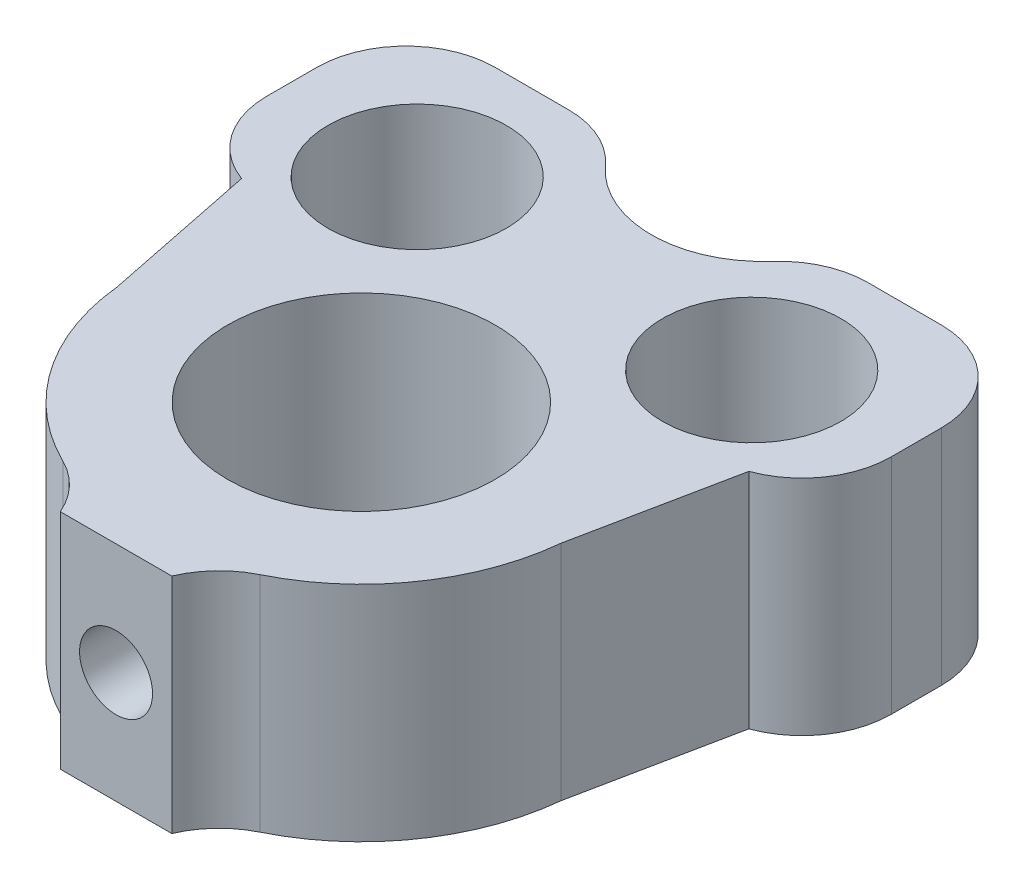
ISO-10303-21;
HEADER;
FILE_DESCRIPTION(('STEP AP214'),'2;1');
FILE_NAME('part.step','',(''),(''),'','','');
FILE_SCHEMA(('AUTOMOTIVE_DESIGN { 1 0 10303 214 1 1 1 1 }'));
ENDSEC;
DATA;
#1=APPLICATION_CONTEXT('core data for automotive mechanical design processes');
#2=APPLICATION_PROTOCOL_DEFINITION('international standard','automotive_design',2000,#1);
#3=PRODUCT_CONTEXT('',#1,'mechanical');
#4=PRODUCT('Part','Part','',(#3));
#5=PRODUCT_RELATED_PRODUCT_CATEGORY('part','',(#4));
#6=PRODUCT_DEFINITION_FORMATION('','',#4);
#7=PRODUCT_DEFINITION_CONTEXT('part definition',#1,'design');
#8=PRODUCT_DEFINITION('design','',#6,#7);
#9=PRODUCT_DEFINITION_SHAPE('','',#8);
#10=(LENGTH_UNIT() NAMED_UNIT(*) SI_UNIT(.MILLI.,.METRE.));
#11=(NAMED_UNIT(*) PLANE_ANGLE_UNIT() SI_UNIT($,.RADIAN.));
#12=(NAMED_UNIT(*) SI_UNIT($,.STERADIAN.) SOLID_ANGLE_UNIT());
#13=UNCERTAINTY_MEASURE_WITH_UNIT(LENGTH_MEASURE(1.E-05),#10,'distance_accuracy_value','');
#14=(GEOMETRIC_REPRESENTATION_CONTEXT(3) GLOBAL_UNCERTAINTY_ASSIGNED_CONTEXT((#13)) GLOBAL_UNIT_ASSIGNED_CONTEXT((#10,
#11,#12)) REPRESENTATION_CONTEXT('',''));
#15=CARTESIAN_POINT('',(0.,0.,0.));
#16=DIRECTION('',(0.,0.,1.));
#17=DIRECTION('',(1.,0.,0.));
#18=AXIS2_PLACEMENT_3D('',#15,#16,#17);
#19=CARTESIAN_POINT('',(0.,10.,0.));
#20=DIRECTION('',(0.,-1.,0.));
#21=DIRECTION('',(0.,0.,-1.));
#22=AXIS2_PLACEMENT_3D('',#19,#20,#21);
#23=CYLINDRICAL_SURFACE('',#22,10.);
#24=CARTESIAN_POINT('',(0.,10.,0.));
#25=DIRECTION('',(0.,1.,0.));
#26=DIRECTION('',(0.,0.,1.));
#27=AXIS2_PLACEMENT_3D('',#24,#25,#26);
#28=CIRCLE('',#27,10.);
#29=CARTESIAN_POINT('',(4.4164053143019,10.,8.97192087012619));
#30=VERTEX_POINT('',#29);
#31=CARTESIAN_POINT('',(9.9498743710662,10.,0.999999999999996));
#32=VERTEX_POINT('',#31);
#33=EDGE_CURVE('E218',#30,#32,#28,.T.);
#34=ORIENTED_EDGE('',*,*,#33,.F.);
#35=DIRECTION('',(0.,-1.,0.));
#36=VECTOR('',#35,1.);
#37=CARTESIAN_POINT('',(4.4164053143019,10.,8.97192087012619));
#38=LINE('',#37,#36);
#39=CARTESIAN_POINT('',(4.4164053143019,0.,8.97192087012619));
#40=VERTEX_POINT('',#39);
#41=EDGE_CURVE('E307',#30,#40,#38,.T.);
#42=ORIENTED_EDGE('',*,*,#41,.T.);
#43=CARTESIAN_POINT('',(0.,0.,0.));
#44=DIRECTION('',(0.,1.,0.));
#45=DIRECTION('',(0.,0.,1.));
#46=AXIS2_PLACEMENT_3D('',#43,#44,#45);
#47=CIRCLE('',#46,10.);
#48=CARTESIAN_POINT('',(9.9498743710662,0.,0.999999999999996));
#49=VERTEX_POINT('',#48);
#50=EDGE_CURVE('E237',#40,#49,#47,.T.);
#51=ORIENTED_EDGE('',*,*,#50,.T.);
#52=DIRECTION('',(0.,-1.,0.));
#53=VECTOR('',#52,1.);
#54=CARTESIAN_POINT('',(9.9498743710662,10.,0.999999999999996));
#55=LINE('',#54,#53);
#56=EDGE_CURVE('E226',#49,#32,#55,.F.);
#57=ORIENTED_EDGE('',*,*,#56,.T.);
#58=EDGE_LOOP('',(#34,#42,#51,#57));
#59=FACE_BOUND('',#58,.T.);
#60=ADVANCED_FACE('F37',(#59),#23,.T.);
#61=CARTESIAN_POINT('',(-9.9498743710662,0.,0.999999999999996));
#62=VERTEX_POINT('',#61);
#63=CARTESIAN_POINT('',(-4.4164053143019,0.,8.97192087012619));
#64=VERTEX_POINT('',#63);
#65=EDGE_CURVE('E238',#62,#64,#47,.T.);
#66=ORIENTED_EDGE('',*,*,#65,.T.);
#67=DIRECTION('',(0.,-1.,0.));
#68=VECTOR('',#67,1.);
#69=CARTESIAN_POINT('',(-4.4164053143019,10.,8.97192087012619));
#70=LINE('',#69,#68);
#71=CARTESIAN_POINT('',(-4.4164053143019,10.,8.97192087012619));
#72=VERTEX_POINT('',#71);
#73=EDGE_CURVE('E305',#64,#72,#70,.F.);
#74=ORIENTED_EDGE('',*,*,#73,.T.);
#75=CARTESIAN_POINT('',(-9.9498743710662,10.,0.999999999999996));
#76=VERTEX_POINT('',#75);
#77=EDGE_CURVE('E170',#76,#72,#28,.T.);
#78=ORIENTED_EDGE('',*,*,#77,.F.);
#79=DIRECTION('',(0.,-1.,0.));
#80=VECTOR('',#79,1.);
#81=CARTESIAN_POINT('',(-9.9498743710662,10.,0.999999999999996));
#82=LINE('',#81,#80);
#83=EDGE_CURVE('E248',#76,#62,#82,.T.);
#84=ORIENTED_EDGE('',*,*,#83,.T.);
#85=EDGE_LOOP('',(#66,#74,#78,#84));
#86=FACE_BOUND('',#85,.T.);
#87=ADVANCED_FACE('F356',(#86),#23,.T.);
#88=CARTESIAN_POINT('',(0.,10.,-18.));
#89=DIRECTION('',(0.,-1.,0.));
#90=DIRECTION('',(0.,0.,-1.));
#91=AXIS2_PLACEMENT_3D('',#88,#89,#90);
#92=CYLINDRICAL_SURFACE('',#91,5.);
#93=CARTESIAN_POINT('',(0.,10.,-18.));
#94=DIRECTION('',(0.,1.,0.));
#95=DIRECTION('',(0.,0.,1.));
#96=AXIS2_PLACEMENT_3D('',#93,#94,#95);
#97=CIRCLE('',#96,5.);
#98=CARTESIAN_POINT('',(-3.72677996249965,10.,-14.6666666666667));
#99=VERTEX_POINT('',#98);
#100=CARTESIAN_POINT('',(3.72677996249965,10.,-14.6666666666667));
#101=VERTEX_POINT('',#100);
#102=EDGE_CURVE('E209',#99,#101,#97,.T.);
#103=ORIENTED_EDGE('',*,*,#102,.T.);
#104=DIRECTION('',(0.,-1.,0.));
#105=VECTOR('',#104,1.);
#106=CARTESIAN_POINT('',(3.72677996249965,10.,-14.6666666666667));
#107=LINE('',#106,#105);
#108=CARTESIAN_POINT('',(3.72677996249965,0.,-14.6666666666667));
#109=VERTEX_POINT('',#108);
#110=EDGE_CURVE('E269',#101,#109,#107,.T.);
#111=ORIENTED_EDGE('',*,*,#110,.T.);
#112=CARTESIAN_POINT('',(0.,0.,-18.));
#113=DIRECTION('',(0.,1.,0.));
#114=DIRECTION('',(0.,0.,1.));
#115=AXIS2_PLACEMENT_3D('',#112,#113,#114);
#116=CIRCLE('',#115,5.);
#117=CARTESIAN_POINT('',(-3.72677996249965,0.,-14.6666666666667));
#118=VERTEX_POINT('',#117);
#119=EDGE_CURVE('E229',#118,#109,#116,.T.);
#120=ORIENTED_EDGE('',*,*,#119,.F.);
#121=DIRECTION('',(0.,-1.,0.));
#122=VECTOR('',#121,1.);
#123=CARTESIAN_POINT('',(-3.72677996249965,10.,-14.6666666666667));
#124=LINE('',#123,#122);
#125=EDGE_CURVE('E267',#118,#99,#124,.F.);
#126=ORIENTED_EDGE('',*,*,#125,.T.);
#127=EDGE_LOOP('',(#103,#111,#120,#126));
#128=FACE_BOUND('',#127,.T.);
#129=ADVANCED_FACE('F361',(#128),#92,.F.);
#130=CARTESIAN_POINT('',(0.,10.,-16.));
#131=DIRECTION('',(0.,0.,-1.));
#132=DIRECTION('',(-1.,0.,0.));
#133=AXIS2_PLACEMENT_3D('',#130,#131,#132);
#134=PLANE('',#133);
#135=DIRECTION('',(1.,0.,0.));
#136=VECTOR('',#135,1.);
#137=CARTESIAN_POINT('',(0.,10.,-16.));
#138=LINE('',#137,#136);
#139=CARTESIAN_POINT('',(-10.,10.,-16.));
#140=VERTEX_POINT('',#139);
#141=CARTESIAN_POINT('',(-6.70820393249937,10.,-16.));
#142=VERTEX_POINT('',#141);
#143=EDGE_CURVE('E213',#140,#142,#138,.T.);
#144=ORIENTED_EDGE('',*,*,#143,.T.);
#145=DIRECTION('',(0.,-1.,0.));
#146=VECTOR('',#145,1.);
#147=CARTESIAN_POINT('',(-6.70820393249937,10.,-16.));
#148=LINE('',#147,#146);
#149=CARTESIAN_POINT('',(-6.70820393249937,0.,-16.));
#150=VERTEX_POINT('',#149);
#151=EDGE_CURVE('E302',#142,#150,#148,.T.);
#152=ORIENTED_EDGE('',*,*,#151,.T.);
#153=DIRECTION('',(1.,0.,0.));
#154=VECTOR('',#153,1.);
#155=CARTESIAN_POINT('',(0.,0.,-16.));
#156=LINE('',#155,#154);
#157=CARTESIAN_POINT('',(-10.,0.,-16.));
#158=VERTEX_POINT('',#157);
#159=EDGE_CURVE('E232',#158,#150,#156,.T.);
#160=ORIENTED_EDGE('',*,*,#159,.F.);
#161=DIRECTION('',(0.,-1.,0.));
#162=VECTOR('',#161,1.);
#163=CARTESIAN_POINT('',(-10.,10.,-16.));
#164=LINE('',#163,#162);
#165=EDGE_CURVE('E300',#158,#140,#164,.F.);
#166=ORIENTED_EDGE('',*,*,#165,.T.);
#167=EDGE_LOOP('',(#144,#152,#160,#166));
#168=FACE_BOUND('',#167,.T.);
#169=ADVANCED_FACE('F369',(#168),#134,.T.);
#170=CARTESIAN_POINT('',(-14.,10.,0.));
#171=DIRECTION('',(1.,0.,0.));
#172=DIRECTION('',(0.,0.,-1.));
#173=AXIS2_PLACEMENT_3D('',#170,#171,#172);
#174=PLANE('',#173);
#175=DIRECTION('',(0.,0.,1.));
#176=VECTOR('',#175,1.);
#177=CARTESIAN_POINT('',(-14.,0.,0.));
#178=LINE('',#177,#176);
#179=CARTESIAN_POINT('',(-14.,0.,-12.));
#180=VERTEX_POINT('',#179);
#181=CARTESIAN_POINT('',(-14.,0.,-9.75760262150014));
#182=VERTEX_POINT('',#181);
#183=EDGE_CURVE('E235',#180,#182,#178,.T.);
#184=ORIENTED_EDGE('',*,*,#183,.T.);
#185=DIRECTION('',(0.,-1.,0.));
#186=VECTOR('',#185,1.);
#187=CARTESIAN_POINT('',(-14.,10.,-9.75760262150014));
#188=LINE('',#187,#186);
#189=CARTESIAN_POINT('',(-14.,10.,-9.75760262150014));
#190=VERTEX_POINT('',#189);
#191=EDGE_CURVE('E52',#182,#190,#188,.F.);
#192=ORIENTED_EDGE('',*,*,#191,.T.);
#193=DIRECTION('',(0.,0.,1.));
#194=VECTOR('',#193,1.);
#195=CARTESIAN_POINT('',(-14.,10.,0.));
#196=LINE('',#195,#194);
#197=CARTESIAN_POINT('',(-14.,10.,-12.));
#198=VERTEX_POINT('',#197);
#199=EDGE_CURVE('E216',#198,#190,#196,.T.);
#200=ORIENTED_EDGE('',*,*,#199,.F.);
#201=DIRECTION('',(0.,-1.,0.));
#202=VECTOR('',#201,1.);
#203=CARTESIAN_POINT('',(-14.,0.,-12.));
#204=LINE('',#203,#202);
#205=EDGE_CURVE('E314',#198,#180,#204,.T.);
#206=ORIENTED_EDGE('',*,*,#205,.T.);
#207=EDGE_LOOP('',(#184,#192,#200,#206));
#208=FACE_BOUND('',#207,.T.);
#209=ADVANCED_FACE('F366',(#208),#174,.F.);
#210=CARTESIAN_POINT('',(14.,10.,0.));
#211=DIRECTION('',(1.,0.,0.));
#212=DIRECTION('',(0.,0.,-1.));
#213=AXIS2_PLACEMENT_3D('',#210,#211,#212);
#214=PLANE('',#213);
#215=DIRECTION('',(0.,0.,1.));
#216=VECTOR('',#215,1.);
#217=CARTESIAN_POINT('',(14.,0.,0.));
#218=LINE('',#217,#216);
#219=CARTESIAN_POINT('',(14.,0.,-12.));
#220=VERTEX_POINT('',#219);
#221=CARTESIAN_POINT('',(14.,0.,-9.75760262150014));
#222=VERTEX_POINT('',#221);
#223=EDGE_CURVE('E241',#220,#222,#218,.T.);
#224=ORIENTED_EDGE('',*,*,#223,.F.);
#225=DIRECTION('',(0.,-1.,0.));
#226=VECTOR('',#225,1.);
#227=CARTESIAN_POINT('',(14.,10.,-12.));
#228=LINE('',#227,#226);
#229=CARTESIAN_POINT('',(14.,10.,-12.));
#230=VERTEX_POINT('',#229);
#231=EDGE_CURVE('E312',#220,#230,#228,.F.);
#232=ORIENTED_EDGE('',*,*,#231,.T.);
#233=DIRECTION('',(0.,0.,1.));
#234=VECTOR('',#233,1.);
#235=CARTESIAN_POINT('',(14.,10.,0.));
#236=LINE('',#235,#234);
#237=CARTESIAN_POINT('',(14.,10.,-9.75760262150014));
#238=VERTEX_POINT('',#237);
#239=EDGE_CURVE('E220',#230,#238,#236,.T.);
#240=ORIENTED_EDGE('',*,*,#239,.T.);
#241=DIRECTION('',(0.,-1.,0.));
#242=VECTOR('',#241,1.);
#243=CARTESIAN_POINT('',(14.,0.,-9.75760262150014));
#244=LINE('',#243,#242);
#245=EDGE_CURVE('E309',#238,#222,#244,.T.);
#246=ORIENTED_EDGE('',*,*,#245,.T.);
#247=EDGE_LOOP('',(#224,#232,#240,#246));
#248=FACE_BOUND('',#247,.T.);
#249=ADVANCED_FACE('F341',(#248),#214,.T.);
#250=CARTESIAN_POINT('',(0.,10.,0.));
#251=DIRECTION('',(0.,-1.,0.));
#252=DIRECTION('',(0.,0.,-1.));
#253=AXIS2_PLACEMENT_3D('',#250,#251,#252);
#254=CYLINDRICAL_SURFACE('',#253,6.);
#255=CARTESIAN_POINT('',(1.635125,5.,5.77289929189615));
#256=CARTESIAN_POINT('',(1.63512298519692,4.91000375329795,5.77290077436245));
#257=CARTESIAN_POINT('',(1.62766968552191,4.81998649751158,5.77502679013465));
#258=CARTESIAN_POINT('',(1.59811326653668,4.6425570713168,5.78327431075979));
#259=CARTESIAN_POINT('',(1.57600322043377,4.55514615308706,5.78939770475672));
#260=CARTESIAN_POINT('',(1.5179184156342,4.38552198827226,5.80489610436897));
#261=CARTESIAN_POINT('',(1.48196374143222,4.30330141221212,5.81426639772338));
#262=CARTESIAN_POINT('',(1.39727379172247,4.1460450833563,5.83519673272147));
#263=CARTESIAN_POINT('',(1.34853736297535,4.07100997970734,5.84675697192782));
#264=CARTESIAN_POINT('',(1.23830585587462,3.92829473627442,5.87110305087299));
#265=CARTESIAN_POINT('',(1.17653672092494,3.86083006595965,5.88391138248032));
#266=CARTESIAN_POINT('',(1.04258226060557,3.73707792736079,5.90911668267034));
#267=CARTESIAN_POINT('',(0.970395815988017,3.68079166164353,5.92151360687469));
#268=CARTESIAN_POINT('',(0.816155249502934,3.58008939043623,5.94475103913129));
#269=CARTESIAN_POINT('',(0.733955818670263,3.53588851756313,5.95556192542825));
#270=CARTESIAN_POINT('',(0.562948059077927,3.46201631475344,5.97415057479511));
#271=CARTESIAN_POINT('',(0.474140899364251,3.4323424216971,5.98192887288122));
#272=CARTESIAN_POINT('',(0.294688572937397,3.38906649410258,5.99341688723204));
#273=CARTESIAN_POINT('',(0.204137887369938,3.37509771335294,5.9972192933042));
#274=CARTESIAN_POINT('',(0.0219037979959537,3.36247370964267,6.00065156608423));
#275=CARTESIAN_POINT('',(-0.0697794053470975,3.36381581427557,6.00028216095226));
#276=CARTESIAN_POINT('',(-0.249119916467367,3.38151924103723,5.9954799472914));
#277=CARTESIAN_POINT('',(-0.33681966513502,3.39748417999799,5.9911543833868));
#278=CARTESIAN_POINT('',(-0.508244771487161,3.44333852825979,5.97905305422252));
#279=CARTESIAN_POINT('',(-0.591969897324019,3.47322874875305,5.97127708796711));
#280=CARTESIAN_POINT('',(-0.754069236573398,3.54638292677178,5.95299142109105));
#281=CARTESIAN_POINT('',(-0.832379820650359,3.58978079968337,5.94245452171454));
#282=CARTESIAN_POINT('',(-0.980740756912661,3.68861510803554,5.91977940684104));
#283=CARTESIAN_POINT('',(-1.05078943324005,3.74405397943264,5.90764086751929));
#284=CARTESIAN_POINT('',(-1.18300438191738,3.86749290347586,5.88261655469344));
#285=CARTESIAN_POINT('',(-1.24484639029213,3.93583836108446,5.8697193002789));
#286=CARTESIAN_POINT('',(-1.35627231432687,4.08206261338278,5.84498007645499));
#287=CARTESIAN_POINT('',(-1.4058554123767,4.1599420434248,5.8331381774664));
#288=CARTESIAN_POINT('',(-1.49161767441891,4.32375155057829,5.81180278075948));
#289=CARTESIAN_POINT('',(-1.52770497781927,4.40973198555712,5.80232551834122));
#290=CARTESIAN_POINT('',(-1.58480422905498,4.58686306013233,5.78699225535697));
#291=CARTESIAN_POINT('',(-1.60582010732332,4.67801234506354,5.78113531071391));
#292=CARTESIAN_POINT('',(-1.63161314351331,4.85985198340415,5.77390800546146));
#293=CARTESIAN_POINT('',(-1.6368755629965,4.9504682520841,5.7724036212407));
#294=CARTESIAN_POINT('',(-1.6323523563076,5.13128671445977,5.77368441141354));
#295=CARTESIAN_POINT('',(-1.62256841291026,5.2214889533287,5.77646910611959));
#296=CARTESIAN_POINT('',(-1.58865879648034,5.39702385374651,5.78588447122487));
#297=CARTESIAN_POINT('',(-1.56482825141144,5.482418192914,5.79243593178924));
#298=CARTESIAN_POINT('',(-1.50383544526522,5.64799685472993,5.80856846976467));
#299=CARTESIAN_POINT('',(-1.46667138675299,5.72818047322089,5.81814995562005));
#300=CARTESIAN_POINT('',(-1.37909235464982,5.88308233796589,5.83953546713665));
#301=CARTESIAN_POINT('',(-1.32839431123591,5.95763407922453,5.85138522732406));
#302=CARTESIAN_POINT('',(-1.21553480445696,6.09735003701422,5.87586614087553));
#303=CARTESIAN_POINT('',(-1.15337108703171,6.1625124031743,5.88849744756038));
#304=CARTESIAN_POINT('',(-1.01709400433403,6.28363224317477,5.91358224256265));
#305=CARTESIAN_POINT('',(-0.942675240154341,6.33925034614051,5.9260187005565));
#306=CARTESIAN_POINT('',(-0.785277572379418,6.43720677407253,5.94892041845398));
#307=CARTESIAN_POINT('',(-0.702299124538363,6.47954580558889,5.95938578322328));
#308=CARTESIAN_POINT('',(-0.530721235451654,6.54934778696696,5.9770986802536));
#309=CARTESIAN_POINT('',(-0.442169930062462,6.57692263713407,5.98437034027059));
#310=CARTESIAN_POINT('',(-0.26146157468052,6.61673322568729,5.99498284391056));
#311=CARTESIAN_POINT('',(-0.16930536715142,6.62897252615799,5.99832460034588));
#312=CARTESIAN_POINT('',(0.012832373403676,6.63753323780737,6.00065555153018));
#313=CARTESIAN_POINT('',(0.102789141508624,6.63435143371752,5.99978059134118));
#314=CARTESIAN_POINT('',(0.280836768958848,6.61331945837892,5.99408580615749));
#315=CARTESIAN_POINT('',(0.368927703835399,6.59546988206865,5.98926614116371));
#316=CARTESIAN_POINT('',(0.540117446157044,6.54589485104388,5.97625253608875));
#317=CARTESIAN_POINT('',(0.6232486541451,6.51427414099283,5.96808409413599));
#318=CARTESIAN_POINT('',(0.783072859085873,6.43814772330786,5.94922515775362));
#319=CARTESIAN_POINT('',(0.859764920871636,6.39364014825617,5.93853429784551));
#320=CARTESIAN_POINT('',(1.00683047814897,6.29157169132042,5.91540285557668));
#321=CARTESIAN_POINT('',(1.07697103798677,6.2336843194795,5.90292211131068));
#322=CARTESIAN_POINT('',(1.20671046896053,6.10711337329775,5.87777391141744));
#323=CARTESIAN_POINT('',(1.26630652007961,6.03842692010505,5.86510640682146));
#324=CARTESIAN_POINT('',(1.37464089536775,5.89028669767163,5.84067843331906));
#325=CARTESIAN_POINT('',(1.42309452768733,5.81061969859013,5.82894590433642));
#326=CARTESIAN_POINT('',(1.50585283001303,5.64396012071414,5.80811847621204));
#327=CARTESIAN_POINT('',(1.54016636150481,5.55697217119226,5.79902192618808));
#328=CARTESIAN_POINT('',(1.58940810291038,5.39197668713228,5.78570004050569));
#329=CARTESIAN_POINT('',(1.60651058233499,5.31465466391657,5.78093963569049));
#330=CARTESIAN_POINT('',(1.62936920120309,5.15822702255488,5.77453880642296));
#331=CARTESIAN_POINT('',(1.63512677134615,5.07912163058123,5.77289798856234));
#332=CARTESIAN_POINT('',(1.635125,5.,5.77289929189615));
#333=B_SPLINE_CURVE_WITH_KNOTS('',3,(#255,#256,#257,#258,#259,#260,#261,#262,#263,#264,#265,
#266,#267,#268,#269,#270,#271,#272,#273,#274,#275,#276,#277,#278,#279,#280,#281,#282,#283,#284,
#285,#286,#287,#288,#289,#290,#291,#292,#293,#294,#295,#296,#297,#298,#299,#300,#301,#302,#303,
#304,#305,#306,#307,#308,#309,#310,#311,#312,#313,#314,#315,#316,#317,#318,#319,#320,#321,#322,
#323,#324,#325,#326,#327,#328,#329,#330,#331,#332),.UNSPECIFIED.,.T.,.F.,(4,2,2,2,2,2,2,2,2,2,2,
2,2,2,2,2,2,2,2,2,2,2,2,2,2,2,2,2,2,2,2,2,2,2,2,2,2,2,4),(0.,0.269697649839978,
0.539522850009145,0.808958078788854,1.0784176258473,1.35423890998767,1.63008985078103,
1.91057159953333,2.19100384263132,2.46474181508852,2.73843200925486,3.00491599988255,
3.27141551599707,3.54064612844453,3.80993125846018,4.08783998398227,4.36576723967804,
4.64555321875653,4.92526620670625,5.19626955236703,5.46724259140619,5.73271563177333,
5.99822447290018,6.26979308089527,6.54141513413172,6.82128050122903,7.10113097478082,
7.37882926042553,7.6564630313781,7.92521352476596,8.19395311792211,8.46068340536446,
8.72745236368441,9.0015872363846,9.27579531309157,9.55637941782573,9.83678741439464,
10.0739262968588,10.3110352719687),.UNSPECIFIED.);
#334=CARTESIAN_POINT('',(1.635125,5.,5.77289929189615));
#335=VERTEX_POINT('',#334);
#336=EDGE_CURVE('E191',#335,#335,#333,.T.);
#337=ORIENTED_EDGE('',*,*,#336,.F.);
#338=EDGE_LOOP('',(#337));
#339=FACE_BOUND('',#338,.T.);
#340=CARTESIAN_POINT('',(0.,10.,0.));
#341=DIRECTION('',(0.,1.,0.));
#342=DIRECTION('',(0.,0.,1.));
#343=AXIS2_PLACEMENT_3D('',#340,#341,#342);
#344=CIRCLE('',#343,6.);
#345=CARTESIAN_POINT('',(0.,10.,6.));
#346=VERTEX_POINT('',#345);
#347=EDGE_CURVE('E206',#346,#346,#344,.T.);
#348=ORIENTED_EDGE('',*,*,#347,.T.);
#349=EDGE_LOOP('',(#348));
#350=FACE_BOUND('',#349,.T.);
#351=CARTESIAN_POINT('',(0.,0.,0.));
#352=DIRECTION('',(0.,1.,0.));
#353=DIRECTION('',(0.,0.,1.));
#354=AXIS2_PLACEMENT_3D('',#351,#352,#353);
#355=CIRCLE('',#354,6.);
#356=CARTESIAN_POINT('',(0.,0.,6.));
#357=VERTEX_POINT('',#356);
#358=EDGE_CURVE('E203',#357,#357,#355,.T.);
#359=ORIENTED_EDGE('',*,*,#358,.F.);
#360=EDGE_LOOP('',(#359));
#361=FACE_BOUND('',#360,.T.);
#362=ADVANCED_FACE('F376',(#339,#350,#361),#254,.F.);
#363=CARTESIAN_POINT('',(0.,10.,-16.));
#364=DIRECTION('',(0.,0.,-1.));
#365=DIRECTION('',(-1.,0.,0.));
#366=AXIS2_PLACEMENT_3D('',#363,#364,#365);
#367=PLANE('',#366);
#368=DIRECTION('',(1.,0.,0.));
#369=VECTOR('',#368,1.);
#370=CARTESIAN_POINT('',(0.,0.,-16.));
#371=LINE('',#370,#369);
#372=CARTESIAN_POINT('',(6.70820393249938,0.,-16.));
#373=VERTEX_POINT('',#372);
#374=CARTESIAN_POINT('',(10.,0.,-16.));
#375=VERTEX_POINT('',#374);
#376=EDGE_CURVE('E210',#373,#375,#371,.T.);
#377=ORIENTED_EDGE('',*,*,#376,.F.);
#378=DIRECTION('',(0.,-1.,0.));
#379=VECTOR('',#378,1.);
#380=CARTESIAN_POINT('',(6.70820393249938,10.,-16.));
#381=LINE('',#380,#379);
#382=CARTESIAN_POINT('',(6.70820393249938,10.,-16.));
#383=VERTEX_POINT('',#382);
#384=EDGE_CURVE('E287',#373,#383,#381,.F.);
#385=ORIENTED_EDGE('',*,*,#384,.T.);
#386=DIRECTION('',(1.,0.,0.));
#387=VECTOR('',#386,1.);
#388=CARTESIAN_POINT('',(0.,10.,-16.));
#389=LINE('',#388,#387);
#390=CARTESIAN_POINT('',(10.,10.,-16.));
#391=VERTEX_POINT('',#390);
#392=EDGE_CURVE('E223',#383,#391,#389,.T.);
#393=ORIENTED_EDGE('',*,*,#392,.T.);
#394=DIRECTION('',(0.,-1.,0.));
#395=VECTOR('',#394,1.);
#396=CARTESIAN_POINT('',(10.,10.,-16.));
#397=LINE('',#396,#395);
#398=EDGE_CURVE('E284',#391,#375,#397,.T.);
#399=ORIENTED_EDGE('',*,*,#398,.T.);
#400=EDGE_LOOP('',(#377,#385,#393,#399));
#401=FACE_BOUND('',#400,.T.);
#402=ADVANCED_FACE('F380',(#401),#367,.T.);
#403=CARTESIAN_POINT('',(0.,10.,0.));
#404=DIRECTION('',(0.,1.,0.));
#405=DIRECTION('',(0.,0.,1.));
#406=AXIS2_PLACEMENT_3D('',#403,#404,#405);
#407=PLANE('',#406);
#408=ORIENTED_EDGE('',*,*,#392,.F.);
#409=CARTESIAN_POINT('',(6.70820393249937,10.,-12.));
#410=DIRECTION('',(0.,1.,0.));
#411=DIRECTION('',(0.,0.,1.));
#412=AXIS2_PLACEMENT_3D('',#409,#410,#411);
#413=CIRCLE('',#412,4.);
#414=EDGE_CURVE('E298',#383,#101,#413,.T.);
#415=ORIENTED_EDGE('',*,*,#414,.T.);
#416=ORIENTED_EDGE('',*,*,#102,.F.);
#417=CARTESIAN_POINT('',(-6.70820393249937,10.,-12.));
#418=DIRECTION('',(0.,1.,0.));
#419=DIRECTION('',(0.,0.,1.));
#420=AXIS2_PLACEMENT_3D('',#417,#418,#419);
#421=CIRCLE('',#420,4.);
#422=EDGE_CURVE('E296',#99,#142,#421,.T.);
#423=ORIENTED_EDGE('',*,*,#422,.T.);
#424=ORIENTED_EDGE('',*,*,#143,.F.);
#425=CARTESIAN_POINT('',(-10.,10.,-12.));
#426=DIRECTION('',(0.,1.,0.));
#427=DIRECTION('',(0.,0.,1.));
#428=AXIS2_PLACEMENT_3D('',#425,#426,#427);
#429=CIRCLE('',#428,4.);
#430=EDGE_CURVE('E59',#140,#198,#429,.T.);
#431=ORIENTED_EDGE('',*,*,#430,.T.);
#432=ORIENTED_EDGE('',*,*,#199,.T.);
#433=CARTESIAN_POINT('',(-10.,10.,-9.75760262150014));
#434=DIRECTION('',(0.,1.,0.));
#435=DIRECTION('',(0.,0.,1.));
#436=AXIS2_PLACEMENT_3D('',#433,#434,#435);
#437=CIRCLE('',#436,4.);
#438=CARTESIAN_POINT('',(-11.3712849955043,10.,-6.));
#439=VERTEX_POINT('',#438);
#440=EDGE_CURVE('E290',#190,#439,#437,.T.);
#441=ORIENTED_EDGE('',*,*,#440,.T.);
#442=DIRECTION('',(0.198997487421337,0.,0.979999999999997));
#443=VECTOR('',#442,1.);
#444=CARTESIAN_POINT('',(-9.9498743710662,10.,0.99999999999999));
#445=LINE('',#444,#443);
#446=EDGE_CURVE('E260',#439,#76,#445,.T.);
#447=ORIENTED_EDGE('',*,*,#446,.T.);
#448=ORIENTED_EDGE('',*,*,#77,.T.);
#449=CARTESIAN_POINT('',(-6.18296744002267,10.,12.5606892181767));
#450=DIRECTION('',(0.,1.,0.));
#451=DIRECTION('',(0.,0.,1.));
#452=AXIS2_PLACEMENT_3D('',#449,#450,#451);
#453=CIRCLE('',#452,4.);
#454=CARTESIAN_POINT('',(-2.5,10.,11.));
#455=VERTEX_POINT('',#454);
#456=EDGE_CURVE('E163',#72,#455,#453,.F.);
#457=ORIENTED_EDGE('',*,*,#456,.T.);
#458=DIRECTION('',(1.,0.,0.));
#459=VECTOR('',#458,1.);
#460=CARTESIAN_POINT('',(-2.5,10.,11.));
#461=LINE('',#460,#459);
#462=CARTESIAN_POINT('',(2.5,10.,11.));
#463=VERTEX_POINT('',#462);
#464=EDGE_CURVE('E168',#455,#463,#461,.T.);
#465=ORIENTED_EDGE('',*,*,#464,.T.);
#466=CARTESIAN_POINT('',(6.18296744002267,10.,12.5606892181767));
#467=DIRECTION('',(0.,1.,0.));
#468=DIRECTION('',(0.,0.,1.));
#469=AXIS2_PLACEMENT_3D('',#466,#467,#468);
#470=CIRCLE('',#469,4.);
#471=EDGE_CURVE('E45',#463,#30,#470,.F.);
#472=ORIENTED_EDGE('',*,*,#471,.T.);
#473=ORIENTED_EDGE('',*,*,#33,.T.);
#474=DIRECTION('',(0.198997487421337,0.,-0.979999999999997));
#475=VECTOR('',#474,1.);
#476=CARTESIAN_POINT('',(11.3712849955043,10.,-6.));
#477=LINE('',#476,#475);
#478=CARTESIAN_POINT('',(11.3712849955043,10.,-6.));
#479=VERTEX_POINT('',#478);
#480=EDGE_CURVE('E265',#32,#479,#477,.T.);
#481=ORIENTED_EDGE('',*,*,#480,.T.);
#482=CARTESIAN_POINT('',(10.,10.,-9.75760262150014));
#483=DIRECTION('',(0.,1.,0.));
#484=DIRECTION('',(0.,0.,1.));
#485=AXIS2_PLACEMENT_3D('',#482,#483,#484);
#486=CIRCLE('',#485,4.);
#487=EDGE_CURVE('E292',#479,#238,#486,.T.);
#488=ORIENTED_EDGE('',*,*,#487,.T.);
#489=ORIENTED_EDGE('',*,*,#239,.F.);
#490=CARTESIAN_POINT('',(10.,10.,-12.));
#491=DIRECTION('',(0.,1.,0.));
#492=DIRECTION('',(0.,0.,1.));
#493=AXIS2_PLACEMENT_3D('',#490,#491,#492);
#494=CIRCLE('',#493,4.);
#495=EDGE_CURVE('E294',#230,#391,#494,.T.);
#496=ORIENTED_EDGE('',*,*,#495,.T.);
#497=EDGE_LOOP('',(#408,#415,#416,#423,#424,#431,#432,#441,#447,#448,#457,#465,#472,#473,#481,
#488,#489,#496));
#498=FACE_BOUND('',#497,.T.);
#499=CARTESIAN_POINT('',(7.5,10.,-10.));
#500=DIRECTION('',(0.,1.,0.));
#501=DIRECTION('',(0.,0.,1.));
#502=AXIS2_PLACEMENT_3D('',#499,#500,#501);
#503=CIRCLE('',#502,4.);
#504=CARTESIAN_POINT('',(7.5,10.,-6.));
#505=VERTEX_POINT('',#504);
#506=EDGE_CURVE('E185',#505,#505,#503,.T.);
#507=ORIENTED_EDGE('',*,*,#506,.F.);
#508=EDGE_LOOP('',(#507));
#509=FACE_BOUND('',#508,.T.);
#510=CARTESIAN_POINT('',(-7.5,10.,-10.));
#511=DIRECTION('',(0.,1.,0.));
#512=DIRECTION('',(0.,0.,1.));
#513=AXIS2_PLACEMENT_3D('',#510,#511,#512);
#514=CIRCLE('',#513,4.);
#515=CARTESIAN_POINT('',(-7.5,10.,-6.));
#516=VERTEX_POINT('',#515);
#517=EDGE_CURVE('E197',#516,#516,#514,.T.);
#518=ORIENTED_EDGE('',*,*,#517,.F.);
#519=EDGE_LOOP('',(#518));
#520=FACE_BOUND('',#519,.T.);
#521=ORIENTED_EDGE('',*,*,#347,.F.);
#522=EDGE_LOOP('',(#521));
#523=FACE_BOUND('',#522,.T.);
#524=ADVANCED_FACE('F166',(#498,#509,#520,#523),#407,.T.);
#525=CARTESIAN_POINT('',(0.,0.,0.));
#526=DIRECTION('',(0.,1.,0.));
#527=DIRECTION('',(0.,0.,1.));
#528=AXIS2_PLACEMENT_3D('',#525,#526,#527);
#529=PLANE('',#528);
#530=ORIENTED_EDGE('',*,*,#119,.T.);
#531=CARTESIAN_POINT('',(6.70820393249937,0.,-12.));
#532=DIRECTION('',(0.,1.,0.));
#533=DIRECTION('',(0.,0.,1.));
#534=AXIS2_PLACEMENT_3D('',#531,#532,#533);
#535=CIRCLE('',#534,4.);
#536=EDGE_CURVE('E282',#109,#373,#535,.F.);
#537=ORIENTED_EDGE('',*,*,#536,.T.);
#538=ORIENTED_EDGE('',*,*,#376,.T.);
#539=CARTESIAN_POINT('',(10.,0.,-12.));
#540=DIRECTION('',(0.,1.,0.));
#541=DIRECTION('',(0.,0.,1.));
#542=AXIS2_PLACEMENT_3D('',#539,#540,#541);
#543=CIRCLE('',#542,4.);
#544=EDGE_CURVE('E278',#375,#220,#543,.F.);
#545=ORIENTED_EDGE('',*,*,#544,.T.);
#546=ORIENTED_EDGE('',*,*,#223,.T.);
#547=CARTESIAN_POINT('',(10.,0.,-9.75760262150014));
#548=DIRECTION('',(0.,1.,0.));
#549=DIRECTION('',(0.,0.,1.));
#550=AXIS2_PLACEMENT_3D('',#547,#548,#549);
#551=CIRCLE('',#550,4.);
#552=CARTESIAN_POINT('',(11.3712849955043,0.,-6.));
#553=VERTEX_POINT('',#552);
#554=EDGE_CURVE('E276',#222,#553,#551,.F.);
#555=ORIENTED_EDGE('',*,*,#554,.T.);
#556=DIRECTION('',(-0.198997487421337,0.,0.979999999999997));
#557=VECTOR('',#556,1.);
#558=CARTESIAN_POINT('',(9.75087688364484,0.,1.98000000000013));
#559=LINE('',#558,#557);
#560=EDGE_CURVE('E262',#553,#49,#559,.T.);
#561=ORIENTED_EDGE('',*,*,#560,.T.);
#562=ORIENTED_EDGE('',*,*,#50,.F.);
#563=CARTESIAN_POINT('',(6.18296744002267,0.,12.5606892181767));
#564=DIRECTION('',(0.,1.,0.));
#565=DIRECTION('',(0.,0.,1.));
#566=AXIS2_PLACEMENT_3D('',#563,#564,#565);
#567=CIRCLE('',#566,4.);
#568=CARTESIAN_POINT('',(2.5,0.,11.));
#569=VERTEX_POINT('',#568);
#570=EDGE_CURVE('E11',#40,#569,#567,.T.);
#571=ORIENTED_EDGE('',*,*,#570,.T.);
#572=DIRECTION('',(1.,0.,0.));
#573=VECTOR('',#572,1.);
#574=CARTESIAN_POINT('',(-2.5,0.,11.));
#575=LINE('',#574,#573);
#576=CARTESIAN_POINT('',(-2.5,0.,11.));
#577=VERTEX_POINT('',#576);
#578=EDGE_CURVE('E186',#577,#569,#575,.T.);
#579=ORIENTED_EDGE('',*,*,#578,.F.);
#580=CARTESIAN_POINT('',(-6.18296744002267,0.,12.5606892181767));
#581=DIRECTION('',(0.,1.,0.));
#582=DIRECTION('',(0.,0.,1.));
#583=AXIS2_PLACEMENT_3D('',#580,#581,#582);
#584=CIRCLE('',#583,4.);
#585=EDGE_CURVE('E174',#577,#64,#584,.T.);
#586=ORIENTED_EDGE('',*,*,#585,.T.);
#587=ORIENTED_EDGE('',*,*,#65,.F.);
#588=DIRECTION('',(-0.198997487421337,0.,-0.979999999999997));
#589=VECTOR('',#588,1.);
#590=CARTESIAN_POINT('',(-9.75087688364484,0.,1.98000000000013));
#591=LINE('',#590,#589);
#592=CARTESIAN_POINT('',(-11.3712849955043,0.,-6.));
#593=VERTEX_POINT('',#592);
#594=EDGE_CURVE('E257',#62,#593,#591,.T.);
#595=ORIENTED_EDGE('',*,*,#594,.T.);
#596=CARTESIAN_POINT('',(-10.,0.,-9.75760262150014));
#597=DIRECTION('',(0.,1.,0.));
#598=DIRECTION('',(0.,0.,1.));
#599=AXIS2_PLACEMENT_3D('',#596,#597,#598);
#600=CIRCLE('',#599,4.);
#601=EDGE_CURVE('E274',#593,#182,#600,.F.);
#602=ORIENTED_EDGE('',*,*,#601,.T.);
#603=ORIENTED_EDGE('',*,*,#183,.F.);
#604=CARTESIAN_POINT('',(-10.,0.,-12.));
#605=DIRECTION('',(0.,1.,0.));
#606=DIRECTION('',(0.,0.,1.));
#607=AXIS2_PLACEMENT_3D('',#604,#605,#606);
#608=CIRCLE('',#607,4.);
#609=EDGE_CURVE('E272',#180,#158,#608,.F.);
#610=ORIENTED_EDGE('',*,*,#609,.T.);
#611=ORIENTED_EDGE('',*,*,#159,.T.);
#612=CARTESIAN_POINT('',(-6.70820393249937,0.,-12.));
#613=DIRECTION('',(0.,1.,0.));
#614=DIRECTION('',(0.,0.,1.));
#615=AXIS2_PLACEMENT_3D('',#612,#613,#614);
#616=CIRCLE('',#615,4.);
#617=EDGE_CURVE('E280',#150,#118,#616,.F.);
#618=ORIENTED_EDGE('',*,*,#617,.T.);
#619=EDGE_LOOP('',(#530,#537,#538,#545,#546,#555,#561,#562,#571,#579,#586,#587,#595,#602,#603,
#610,#611,#618));
#620=FACE_BOUND('',#619,.T.);
#621=ORIENTED_EDGE('',*,*,#358,.T.);
#622=EDGE_LOOP('',(#621));
#623=FACE_BOUND('',#622,.T.);
#624=CARTESIAN_POINT('',(-7.5,0.,-10.));
#625=DIRECTION('',(0.,1.,0.));
#626=DIRECTION('',(0.,0.,1.));
#627=AXIS2_PLACEMENT_3D('',#624,#625,#626);
#628=CIRCLE('',#627,4.);
#629=CARTESIAN_POINT('',(-7.5,0.,-6.));
#630=VERTEX_POINT('',#629);
#631=EDGE_CURVE('E200',#630,#630,#628,.T.);
#632=ORIENTED_EDGE('',*,*,#631,.T.);
#633=EDGE_LOOP('',(#632));
#634=FACE_BOUND('',#633,.T.);
#635=CARTESIAN_POINT('',(7.5,0.,-10.));
#636=DIRECTION('',(0.,1.,0.));
#637=DIRECTION('',(0.,0.,1.));
#638=AXIS2_PLACEMENT_3D('',#635,#636,#637);
#639=CIRCLE('',#638,4.);
#640=CARTESIAN_POINT('',(7.5,0.,-6.));
#641=VERTEX_POINT('',#640);
#642=EDGE_CURVE('E194',#641,#641,#639,.T.);
#643=ORIENTED_EDGE('',*,*,#642,.T.);
#644=EDGE_LOOP('',(#643));
#645=FACE_BOUND('',#644,.T.);
#646=ADVANCED_FACE('F328',(#620,#623,#634,#645),#529,.F.);
#647=CARTESIAN_POINT('',(-7.5,0.,-10.));
#648=DIRECTION('',(0.,1.,0.));
#649=DIRECTION('',(0.,0.,1.));
#650=AXIS2_PLACEMENT_3D('',#647,#648,#649);
#651=CYLINDRICAL_SURFACE('',#650,4.);
#652=ORIENTED_EDGE('',*,*,#631,.F.);
#653=EDGE_LOOP('',(#652));
#654=FACE_BOUND('',#653,.T.);
#655=ORIENTED_EDGE('',*,*,#517,.T.);
#656=EDGE_LOOP('',(#655));
#657=FACE_BOUND('',#656,.T.);
#658=ADVANCED_FACE('F403',(#654,#657),#651,.F.);
#659=CARTESIAN_POINT('',(7.5,0.,-10.));
#660=DIRECTION('',(0.,1.,0.));
#661=DIRECTION('',(0.,0.,1.));
#662=AXIS2_PLACEMENT_3D('',#659,#660,#661);
#663=CYLINDRICAL_SURFACE('',#662,4.);
#664=ORIENTED_EDGE('',*,*,#642,.F.);
#665=EDGE_LOOP('',(#664));
#666=FACE_BOUND('',#665,.T.);
#667=ORIENTED_EDGE('',*,*,#506,.T.);
#668=EDGE_LOOP('',(#667));
#669=FACE_BOUND('',#668,.T.);
#670=ADVANCED_FACE('F400',(#666,#669),#663,.F.);
#671=CARTESIAN_POINT('',(-9.9498743710662,10.,0.99999999999999));
#672=DIRECTION('',(0.979999999999997,0.,-0.198997487421337));
#673=DIRECTION('',(0.,-1.,0.));
#674=AXIS2_PLACEMENT_3D('',#671,#672,#673);
#675=PLANE('',#674);
#676=ORIENTED_EDGE('',*,*,#446,.F.);
#677=DIRECTION('',(0.,1.,0.));
#678=VECTOR('',#677,1.);
#679=CARTESIAN_POINT('',(-11.3712849955043,10.,-6.));
#680=LINE('',#679,#678);
#681=EDGE_CURVE('E251',#593,#439,#680,.T.);
#682=ORIENTED_EDGE('',*,*,#681,.F.);
#683=ORIENTED_EDGE('',*,*,#594,.F.);
#684=ORIENTED_EDGE('',*,*,#83,.F.);
#685=EDGE_LOOP('',(#676,#682,#683,#684));
#686=FACE_BOUND('',#685,.T.);
#687=ADVANCED_FACE('F382',(#686),#675,.F.);
#688=CARTESIAN_POINT('',(11.3712849955043,10.,-6.));
#689=DIRECTION('',(-0.979999999999997,0.,-0.198997487421337));
#690=DIRECTION('',(0.,-1.,0.));
#691=AXIS2_PLACEMENT_3D('',#688,#689,#690);
#692=PLANE('',#691);
#693=ORIENTED_EDGE('',*,*,#480,.F.);
#694=ORIENTED_EDGE('',*,*,#56,.F.);
#695=ORIENTED_EDGE('',*,*,#560,.F.);
#696=DIRECTION('',(0.,-1.,0.));
#697=VECTOR('',#696,1.);
#698=CARTESIAN_POINT('',(11.3712849955043,0.,-6.));
#699=LINE('',#698,#697);
#700=EDGE_CURVE('E254',#479,#553,#699,.T.);
#701=ORIENTED_EDGE('',*,*,#700,.F.);
#702=EDGE_LOOP('',(#693,#694,#695,#701));
#703=FACE_BOUND('',#702,.T.);
#704=ADVANCED_FACE('F333',(#703),#692,.F.);
#705=CARTESIAN_POINT('',(-2.5,15.3851648071345,11.));
#706=DIRECTION('',(0.,0.,-1.));
#707=DIRECTION('',(-1.,0.,0.));
#708=AXIS2_PLACEMENT_3D('',#705,#706,#707);
#709=PLANE('',#708);
#710=CARTESIAN_POINT('',(0.,5.,11.));
#711=DIRECTION('',(0.,0.,1.));
#712=DIRECTION('',(1.,0.,0.));
#713=AXIS2_PLACEMENT_3D('',#710,#711,#712);
#714=CIRCLE('',#713,1.635125);
#715=CARTESIAN_POINT('',(1.635125,5.,11.));
#716=VERTEX_POINT('',#715);
#717=EDGE_CURVE('E390',#716,#716,#714,.T.);
#718=ORIENTED_EDGE('',*,*,#717,.F.);
#719=EDGE_LOOP('',(#718));
#720=FACE_BOUND('',#719,.T.);
#721=ORIENTED_EDGE('',*,*,#464,.F.);
#722=DIRECTION('',(0.,-1.,0.));
#723=VECTOR('',#722,1.);
#724=CARTESIAN_POINT('',(-2.5,15.3851648071345,11.));
#725=LINE('',#724,#723);
#726=EDGE_CURVE('E181',#455,#577,#725,.T.);
#727=ORIENTED_EDGE('',*,*,#726,.T.);
#728=ORIENTED_EDGE('',*,*,#578,.T.);
#729=DIRECTION('',(0.,-1.,0.));
#730=VECTOR('',#729,1.);
#731=CARTESIAN_POINT('',(2.5,15.3851648071345,11.));
#732=LINE('',#731,#730);
#733=EDGE_CURVE('E184',#463,#569,#732,.T.);
#734=ORIENTED_EDGE('',*,*,#733,.F.);
#735=EDGE_LOOP('',(#721,#727,#728,#734));
#736=FACE_BOUND('',#735,.T.);
#737=ADVANCED_FACE('F179',(#720,#736),#709,.F.);
#738=CARTESIAN_POINT('',(0.,5.,0.999999999999999));
#739=DIRECTION('',(0.,0.,1.));
#740=DIRECTION('',(1.,0.,0.));
#741=AXIS2_PLACEMENT_3D('',#738,#739,#740);
#742=CYLINDRICAL_SURFACE('',#741,1.635125);
#743=ORIENTED_EDGE('',*,*,#336,.T.);
#744=EDGE_LOOP('',(#743));
#745=FACE_BOUND('',#744,.T.);
#746=ORIENTED_EDGE('',*,*,#717,.T.);
#747=EDGE_LOOP('',(#746));
#748=FACE_BOUND('',#747,.T.);
#749=ADVANCED_FACE('F391',(#745,#748),#742,.F.);
#750=CARTESIAN_POINT('',(6.70820393249937,10.,-12.));
#751=DIRECTION('',(0.,-1.,0.));
#752=DIRECTION('',(0.,0.,-1.));
#753=AXIS2_PLACEMENT_3D('',#750,#751,#752);
#754=CYLINDRICAL_SURFACE('',#753,4.);
#755=ORIENTED_EDGE('',*,*,#414,.F.);
#756=ORIENTED_EDGE('',*,*,#384,.F.);
#757=ORIENTED_EDGE('',*,*,#536,.F.);
#758=ORIENTED_EDGE('',*,*,#110,.F.);
#759=EDGE_LOOP('',(#755,#756,#757,#758));
#760=FACE_BOUND('',#759,.T.);
#761=ADVANCED_FACE('F395',(#760),#754,.T.);
#762=CARTESIAN_POINT('',(-6.70820393249937,10.,-12.));
#763=DIRECTION('',(0.,-1.,0.));
#764=DIRECTION('',(0.,0.,-1.));
#765=AXIS2_PLACEMENT_3D('',#762,#763,#764);
#766=CYLINDRICAL_SURFACE('',#765,4.);
#767=ORIENTED_EDGE('',*,*,#422,.F.);
#768=ORIENTED_EDGE('',*,*,#125,.F.);
#769=ORIENTED_EDGE('',*,*,#617,.F.);
#770=ORIENTED_EDGE('',*,*,#151,.F.);
#771=EDGE_LOOP('',(#767,#768,#769,#770));
#772=FACE_BOUND('',#771,.T.);
#773=ADVANCED_FACE('F426',(#772),#766,.T.);
#774=CARTESIAN_POINT('',(-6.18296744002267,10.,12.5606892181767));
#775=DIRECTION('',(0.,1.,0.));
#776=DIRECTION('',(0.,0.,1.));
#777=AXIS2_PLACEMENT_3D('',#774,#775,#776);
#778=CYLINDRICAL_SURFACE('',#777,4.);
#779=ORIENTED_EDGE('',*,*,#456,.F.);
#780=ORIENTED_EDGE('',*,*,#73,.F.);
#781=ORIENTED_EDGE('',*,*,#585,.F.);
#782=ORIENTED_EDGE('',*,*,#726,.F.);
#783=EDGE_LOOP('',(#779,#780,#781,#782));
#784=FACE_BOUND('',#783,.T.);
#785=ADVANCED_FACE('F188',(#784),#778,.F.);
#786=CARTESIAN_POINT('',(6.18296744002267,10.,12.5606892181767));
#787=DIRECTION('',(0.,-1.,0.));
#788=DIRECTION('',(0.,0.,-1.));
#789=AXIS2_PLACEMENT_3D('',#786,#787,#788);
#790=CYLINDRICAL_SURFACE('',#789,4.);
#791=ORIENTED_EDGE('',*,*,#570,.F.);
#792=ORIENTED_EDGE('',*,*,#41,.F.);
#793=ORIENTED_EDGE('',*,*,#471,.F.);
#794=ORIENTED_EDGE('',*,*,#733,.T.);
#795=EDGE_LOOP('',(#791,#792,#793,#794));
#796=FACE_BOUND('',#795,.T.);
#797=ADVANCED_FACE('F326',(#796),#790,.F.);
#798=CARTESIAN_POINT('',(10.,10.,-12.));
#799=DIRECTION('',(0.,-1.,0.));
#800=DIRECTION('',(0.,0.,-1.));
#801=AXIS2_PLACEMENT_3D('',#798,#799,#800);
#802=CYLINDRICAL_SURFACE('',#801,4.);
#803=ORIENTED_EDGE('',*,*,#495,.F.);
#804=ORIENTED_EDGE('',*,*,#231,.F.);
#805=ORIENTED_EDGE('',*,*,#544,.F.);
#806=ORIENTED_EDGE('',*,*,#398,.F.);
#807=EDGE_LOOP('',(#803,#804,#805,#806));
#808=FACE_BOUND('',#807,.T.);
#809=ADVANCED_FACE('F346',(#808),#802,.T.);
#810=CARTESIAN_POINT('',(10.,10.,-9.75760262150014));
#811=DIRECTION('',(0.,1.,0.));
#812=DIRECTION('',(0.,0.,1.));
#813=AXIS2_PLACEMENT_3D('',#810,#811,#812);
#814=CYLINDRICAL_SURFACE('',#813,4.);
#815=ORIENTED_EDGE('',*,*,#487,.F.);
#816=ORIENTED_EDGE('',*,*,#700,.T.);
#817=ORIENTED_EDGE('',*,*,#554,.F.);
#818=ORIENTED_EDGE('',*,*,#245,.F.);
#819=EDGE_LOOP('',(#815,#816,#817,#818));
#820=FACE_BOUND('',#819,.T.);
#821=ADVANCED_FACE('F343',(#820),#814,.T.);
#822=CARTESIAN_POINT('',(-10.,10.,-9.75760262150014));
#823=DIRECTION('',(0.,-1.,0.));
#824=DIRECTION('',(0.,0.,-1.));
#825=AXIS2_PLACEMENT_3D('',#822,#823,#824);
#826=CYLINDRICAL_SURFACE('',#825,4.);
#827=ORIENTED_EDGE('',*,*,#440,.F.);
#828=ORIENTED_EDGE('',*,*,#191,.F.);
#829=ORIENTED_EDGE('',*,*,#601,.F.);
#830=ORIENTED_EDGE('',*,*,#681,.T.);
#831=EDGE_LOOP('',(#827,#828,#829,#830));
#832=FACE_BOUND('',#831,.T.);
#833=ADVANCED_FACE('F345',(#832),#826,.T.);
#834=CARTESIAN_POINT('',(-10.,10.,-12.));
#835=DIRECTION('',(0.,1.,0.));
#836=DIRECTION('',(0.,0.,1.));
#837=AXIS2_PLACEMENT_3D('',#834,#835,#836);
#838=CYLINDRICAL_SURFACE('',#837,4.);
#839=ORIENTED_EDGE('',*,*,#430,.F.);
#840=ORIENTED_EDGE('',*,*,#165,.F.);
#841=ORIENTED_EDGE('',*,*,#609,.F.);
#842=ORIENTED_EDGE('',*,*,#205,.F.);
#843=EDGE_LOOP('',(#839,#840,#841,#842));
#844=FACE_BOUND('',#843,.T.);
#845=ADVANCED_FACE('F39',(#844),#838,.T.);
#846=CLOSED_SHELL('',(#60,#87,#129,#169,#209,#249,#362,#402,#524,#646,#658,#670,#687,#704,#737,
#749,#761,#773,#785,#797,#809,#821,#833,#845));
#847=MANIFOLD_SOLID_BREP('B2',#846);
#848=ADVANCED_BREP_SHAPE_REPRESENTATION('',(#18,#847),#14);
#849=SHAPE_DEFINITION_REPRESENTATION(#9,#848);
ENDSEC;
END-ISO-10303-21;
